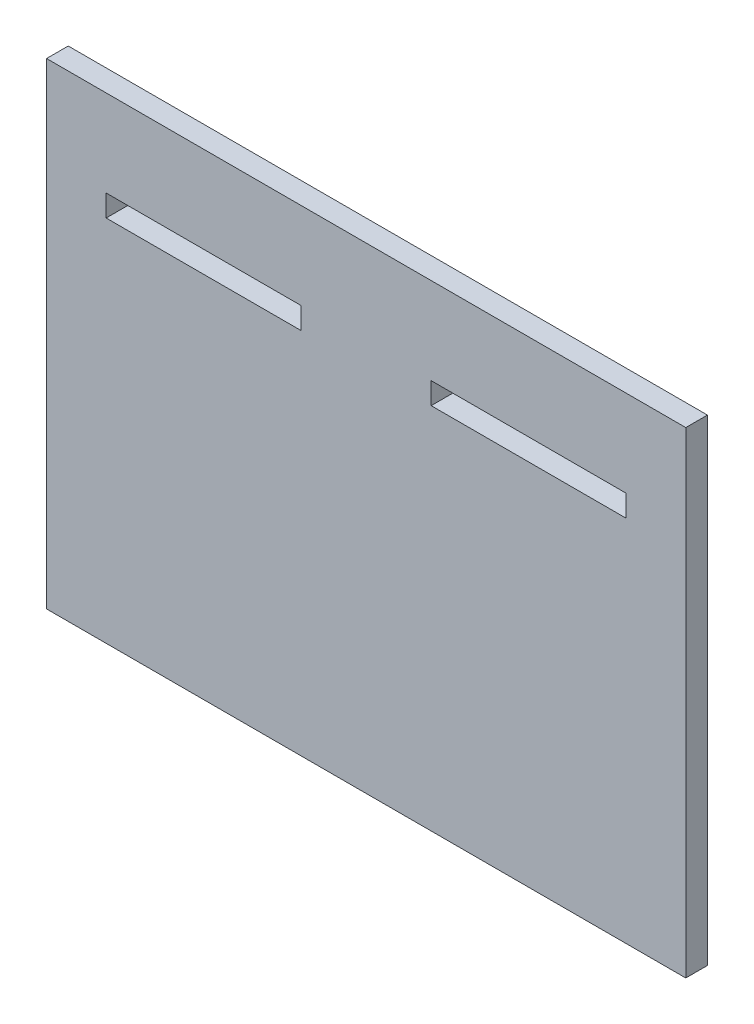
ISO-10303-21;
HEADER;
FILE_DESCRIPTION(('STEP AP214'),'2;1');
FILE_NAME('part.step','',(''),(''),'','','');
FILE_SCHEMA(('AUTOMOTIVE_DESIGN { 1 0 10303 214 1 1 1 1 }'));
ENDSEC;
DATA;
#1=APPLICATION_CONTEXT('core data for automotive mechanical design processes');
#2=APPLICATION_PROTOCOL_DEFINITION('international standard','automotive_design',2000,#1);
#3=PRODUCT_CONTEXT('',#1,'mechanical');
#4=PRODUCT('Part','Part','',(#3));
#5=PRODUCT_RELATED_PRODUCT_CATEGORY('part','',(#4));
#6=PRODUCT_DEFINITION_FORMATION('','',#4);
#7=PRODUCT_DEFINITION_CONTEXT('part definition',#1,'design');
#8=PRODUCT_DEFINITION('design','',#6,#7);
#9=PRODUCT_DEFINITION_SHAPE('','',#8);
#10=(LENGTH_UNIT() NAMED_UNIT(*) SI_UNIT(.MILLI.,.METRE.));
#11=(NAMED_UNIT(*) PLANE_ANGLE_UNIT() SI_UNIT($,.RADIAN.));
#12=(NAMED_UNIT(*) SI_UNIT($,.STERADIAN.) SOLID_ANGLE_UNIT());
#13=UNCERTAINTY_MEASURE_WITH_UNIT(LENGTH_MEASURE(1.E-05),#10,'distance_accuracy_value','');
#14=(GEOMETRIC_REPRESENTATION_CONTEXT(3) GLOBAL_UNCERTAINTY_ASSIGNED_CONTEXT((#13)) GLOBAL_UNIT_ASSIGNED_CONTEXT((#10,
#11,#12)) REPRESENTATION_CONTEXT('',''));
#15=CARTESIAN_POINT('',(0.,0.,0.));
#16=DIRECTION('',(0.,0.,1.));
#17=DIRECTION('',(1.,0.,0.));
#18=AXIS2_PLACEMENT_3D('',#15,#16,#17);
#19=CARTESIAN_POINT('',(0.,0.,10.));
#20=DIRECTION('',(0.,0.,-1.));
#21=DIRECTION('',(-1.,0.,0.));
#22=AXIS2_PLACEMENT_3D('',#19,#20,#21);
#23=PLANE('',#22);
#24=DIRECTION('',(0.,-1.,0.));
#25=VECTOR('',#24,1.);
#26=CARTESIAN_POINT('',(27.5,180.,10.));
#27=LINE('',#26,#25);
#28=CARTESIAN_POINT('',(27.5,180.,10.));
#29=VERTEX_POINT('',#28);
#30=CARTESIAN_POINT('',(27.5,170.,10.));
#31=VERTEX_POINT('',#30);
#32=EDGE_CURVE('E158',#29,#31,#27,.T.);
#33=ORIENTED_EDGE('',*,*,#32,.F.);
#34=DIRECTION('',(-1.,0.,0.));
#35=VECTOR('',#34,1.);
#36=CARTESIAN_POINT('',(27.5,180.,10.));
#37=LINE('',#36,#35);
#38=CARTESIAN_POINT('',(117.5,180.,10.));
#39=VERTEX_POINT('',#38);
#40=EDGE_CURVE('E166',#39,#29,#37,.T.);
#41=ORIENTED_EDGE('',*,*,#40,.F.);
#42=DIRECTION('',(0.,1.,0.));
#43=VECTOR('',#42,1.);
#44=CARTESIAN_POINT('',(117.5,180.,10.));
#45=LINE('',#44,#43);
#46=CARTESIAN_POINT('',(117.5,170.,10.));
#47=VERTEX_POINT('',#46);
#48=EDGE_CURVE('E163',#47,#39,#45,.T.);
#49=ORIENTED_EDGE('',*,*,#48,.F.);
#50=DIRECTION('',(1.,0.,0.));
#51=VECTOR('',#50,1.);
#52=CARTESIAN_POINT('',(27.5,170.,10.));
#53=LINE('',#52,#51);
#54=EDGE_CURVE('E160',#31,#47,#53,.T.);
#55=ORIENTED_EDGE('',*,*,#54,.F.);
#56=EDGE_LOOP('',(#33,#41,#49,#55));
#57=FACE_BOUND('',#56,.T.);
#58=DIRECTION('',(0.,-1.,0.));
#59=VECTOR('',#58,1.);
#60=CARTESIAN_POINT('',(0.,0.,10.));
#61=LINE('',#60,#59);
#62=CARTESIAN_POINT('',(0.,220.,10.));
#63=VERTEX_POINT('',#62);
#64=CARTESIAN_POINT('',(0.,0.,10.));
#65=VERTEX_POINT('',#64);
#66=EDGE_CURVE('E189',#63,#65,#61,.T.);
#67=ORIENTED_EDGE('',*,*,#66,.T.);
#68=DIRECTION('',(1.,0.,0.));
#69=VECTOR('',#68,1.);
#70=CARTESIAN_POINT('',(0.,0.,10.));
#71=LINE('',#70,#69);
#72=CARTESIAN_POINT('',(295.,0.,10.));
#73=VERTEX_POINT('',#72);
#74=EDGE_CURVE('E192',#65,#73,#71,.T.);
#75=ORIENTED_EDGE('',*,*,#74,.T.);
#76=DIRECTION('',(0.,1.,0.));
#77=VECTOR('',#76,1.);
#78=CARTESIAN_POINT('',(295.,0.,10.));
#79=LINE('',#78,#77);
#80=CARTESIAN_POINT('',(295.,220.,10.));
#81=VERTEX_POINT('',#80);
#82=EDGE_CURVE('E195',#73,#81,#79,.T.);
#83=ORIENTED_EDGE('',*,*,#82,.T.);
#84=DIRECTION('',(-1.,0.,0.));
#85=VECTOR('',#84,1.);
#86=CARTESIAN_POINT('',(0.,220.,10.));
#87=LINE('',#86,#85);
#88=EDGE_CURVE('E197',#81,#63,#87,.T.);
#89=ORIENTED_EDGE('',*,*,#88,.T.);
#90=EDGE_LOOP('',(#67,#75,#83,#89));
#91=FACE_BOUND('',#90,.T.);
#92=DIRECTION('',(0.,-1.,0.));
#93=VECTOR('',#92,1.);
#94=CARTESIAN_POINT('',(177.5,180.,10.));
#95=LINE('',#94,#93);
#96=CARTESIAN_POINT('',(177.5,180.,10.));
#97=VERTEX_POINT('',#96);
#98=CARTESIAN_POINT('',(177.5,170.,10.));
#99=VERTEX_POINT('',#98);
#100=EDGE_CURVE('E122',#97,#99,#95,.T.);
#101=ORIENTED_EDGE('',*,*,#100,.F.);
#102=DIRECTION('',(-1.,0.,0.));
#103=VECTOR('',#102,1.);
#104=CARTESIAN_POINT('',(177.5,180.,10.));
#105=LINE('',#104,#103);
#106=CARTESIAN_POINT('',(267.5,180.,10.));
#107=VERTEX_POINT('',#106);
#108=EDGE_CURVE('E144',#107,#97,#105,.T.);
#109=ORIENTED_EDGE('',*,*,#108,.F.);
#110=DIRECTION('',(0.,1.,0.));
#111=VECTOR('',#110,1.);
#112=CARTESIAN_POINT('',(267.5,180.,10.));
#113=LINE('',#112,#111);
#114=CARTESIAN_POINT('',(267.5,170.,10.));
#115=VERTEX_POINT('',#114);
#116=EDGE_CURVE('E142',#115,#107,#113,.T.);
#117=ORIENTED_EDGE('',*,*,#116,.F.);
#118=DIRECTION('',(1.,0.,0.));
#119=VECTOR('',#118,1.);
#120=CARTESIAN_POINT('',(177.5,170.,10.));
#121=LINE('',#120,#119);
#122=EDGE_CURVE('E130',#99,#115,#121,.T.);
#123=ORIENTED_EDGE('',*,*,#122,.F.);
#124=EDGE_LOOP('',(#101,#109,#117,#123));
#125=FACE_BOUND('',#124,.T.);
#126=ADVANCED_FACE('F33',(#57,#91,#125),#23,.F.);
#127=CARTESIAN_POINT('',(0.,0.,0.));
#128=DIRECTION('',(0.,0.,-1.));
#129=DIRECTION('',(-1.,0.,0.));
#130=AXIS2_PLACEMENT_3D('',#127,#128,#129);
#131=PLANE('',#130);
#132=DIRECTION('',(-1.,0.,0.));
#133=VECTOR('',#132,1.);
#134=CARTESIAN_POINT('',(27.5,180.,0.));
#135=LINE('',#134,#133);
#136=CARTESIAN_POINT('',(117.5,180.,0.));
#137=VERTEX_POINT('',#136);
#138=CARTESIAN_POINT('',(27.5,180.,0.));
#139=VERTEX_POINT('',#138);
#140=EDGE_CURVE('E161',#137,#139,#135,.T.);
#141=ORIENTED_EDGE('',*,*,#140,.T.);
#142=DIRECTION('',(0.,-1.,0.));
#143=VECTOR('',#142,1.);
#144=CARTESIAN_POINT('',(27.5,180.,0.));
#145=LINE('',#144,#143);
#146=CARTESIAN_POINT('',(27.5,170.,0.));
#147=VERTEX_POINT('',#146);
#148=EDGE_CURVE('E138',#139,#147,#145,.T.);
#149=ORIENTED_EDGE('',*,*,#148,.T.);
#150=DIRECTION('',(1.,0.,0.));
#151=VECTOR('',#150,1.);
#152=CARTESIAN_POINT('',(27.5,170.,0.));
#153=LINE('',#152,#151);
#154=CARTESIAN_POINT('',(117.5,170.,0.));
#155=VERTEX_POINT('',#154);
#156=EDGE_CURVE('E171',#147,#155,#153,.T.);
#157=ORIENTED_EDGE('',*,*,#156,.T.);
#158=DIRECTION('',(0.,1.,0.));
#159=VECTOR('',#158,1.);
#160=CARTESIAN_POINT('',(117.5,180.,0.));
#161=LINE('',#160,#159);
#162=EDGE_CURVE('E174',#155,#137,#161,.T.);
#163=ORIENTED_EDGE('',*,*,#162,.T.);
#164=EDGE_LOOP('',(#141,#149,#157,#163));
#165=FACE_BOUND('',#164,.T.);
#166=DIRECTION('',(0.,-1.,0.));
#167=VECTOR('',#166,1.);
#168=CARTESIAN_POINT('',(0.,0.,0.));
#169=LINE('',#168,#167);
#170=CARTESIAN_POINT('',(0.,220.,0.));
#171=VERTEX_POINT('',#170);
#172=CARTESIAN_POINT('',(0.,0.,0.));
#173=VERTEX_POINT('',#172);
#174=EDGE_CURVE('E188',#171,#173,#169,.T.);
#175=ORIENTED_EDGE('',*,*,#174,.F.);
#176=DIRECTION('',(-1.,0.,0.));
#177=VECTOR('',#176,1.);
#178=CARTESIAN_POINT('',(0.,220.,0.));
#179=LINE('',#178,#177);
#180=CARTESIAN_POINT('',(295.,220.,0.));
#181=VERTEX_POINT('',#180);
#182=EDGE_CURVE('E193',#181,#171,#179,.T.);
#183=ORIENTED_EDGE('',*,*,#182,.F.);
#184=DIRECTION('',(0.,1.,0.));
#185=VECTOR('',#184,1.);
#186=CARTESIAN_POINT('',(295.,0.,0.));
#187=LINE('',#186,#185);
#188=CARTESIAN_POINT('',(295.,0.,0.));
#189=VERTEX_POINT('',#188);
#190=EDGE_CURVE('E204',#189,#181,#187,.T.);
#191=ORIENTED_EDGE('',*,*,#190,.F.);
#192=DIRECTION('',(1.,0.,0.));
#193=VECTOR('',#192,1.);
#194=CARTESIAN_POINT('',(0.,0.,0.));
#195=LINE('',#194,#193);
#196=EDGE_CURVE('E202',#173,#189,#195,.T.);
#197=ORIENTED_EDGE('',*,*,#196,.F.);
#198=EDGE_LOOP('',(#175,#183,#191,#197));
#199=FACE_BOUND('',#198,.T.);
#200=DIRECTION('',(-1.,0.,0.));
#201=VECTOR('',#200,1.);
#202=CARTESIAN_POINT('',(177.5,180.,0.));
#203=LINE('',#202,#201);
#204=CARTESIAN_POINT('',(267.5,180.,0.));
#205=VERTEX_POINT('',#204);
#206=CARTESIAN_POINT('',(177.5,180.,0.));
#207=VERTEX_POINT('',#206);
#208=EDGE_CURVE('E131',#205,#207,#203,.T.);
#209=ORIENTED_EDGE('',*,*,#208,.T.);
#210=DIRECTION('',(0.,-1.,0.));
#211=VECTOR('',#210,1.);
#212=CARTESIAN_POINT('',(177.5,180.,0.));
#213=LINE('',#212,#211);
#214=CARTESIAN_POINT('',(177.5,170.,0.));
#215=VERTEX_POINT('',#214);
#216=EDGE_CURVE('E56',#207,#215,#213,.T.);
#217=ORIENTED_EDGE('',*,*,#216,.T.);
#218=DIRECTION('',(1.,0.,0.));
#219=VECTOR('',#218,1.);
#220=CARTESIAN_POINT('',(177.5,170.,0.));
#221=LINE('',#220,#219);
#222=CARTESIAN_POINT('',(267.5,170.,0.));
#223=VERTEX_POINT('',#222);
#224=EDGE_CURVE('E137',#215,#223,#221,.T.);
#225=ORIENTED_EDGE('',*,*,#224,.T.);
#226=DIRECTION('',(0.,1.,0.));
#227=VECTOR('',#226,1.);
#228=CARTESIAN_POINT('',(267.5,180.,0.));
#229=LINE('',#228,#227);
#230=EDGE_CURVE('E150',#223,#205,#229,.T.);
#231=ORIENTED_EDGE('',*,*,#230,.T.);
#232=EDGE_LOOP('',(#209,#217,#225,#231));
#233=FACE_BOUND('',#232,.T.);
#234=ADVANCED_FACE('F222',(#165,#199,#233),#131,.T.);
#235=CARTESIAN_POINT('',(0.,0.,10.));
#236=DIRECTION('',(1.,0.,0.));
#237=DIRECTION('',(0.,0.,-1.));
#238=AXIS2_PLACEMENT_3D('',#235,#236,#237);
#239=PLANE('',#238);
#240=ORIENTED_EDGE('',*,*,#174,.T.);
#241=DIRECTION('',(0.,0.,-1.));
#242=VECTOR('',#241,1.);
#243=CARTESIAN_POINT('',(0.,0.,10.));
#244=LINE('',#243,#242);
#245=EDGE_CURVE('E11',#65,#173,#244,.T.);
#246=ORIENTED_EDGE('',*,*,#245,.F.);
#247=ORIENTED_EDGE('',*,*,#66,.F.);
#248=DIRECTION('',(0.,0.,-1.));
#249=VECTOR('',#248,1.);
#250=CARTESIAN_POINT('',(0.,220.,10.));
#251=LINE('',#250,#249);
#252=EDGE_CURVE('E199',#63,#171,#251,.T.);
#253=ORIENTED_EDGE('',*,*,#252,.T.);
#254=EDGE_LOOP('',(#240,#246,#247,#253));
#255=FACE_BOUND('',#254,.T.);
#256=ADVANCED_FACE('F35',(#255),#239,.F.);
#257=CARTESIAN_POINT('',(0.,0.,10.));
#258=DIRECTION('',(0.,1.,0.));
#259=DIRECTION('',(0.,0.,1.));
#260=AXIS2_PLACEMENT_3D('',#257,#258,#259);
#261=PLANE('',#260);
#262=ORIENTED_EDGE('',*,*,#196,.T.);
#263=DIRECTION('',(0.,0.,-1.));
#264=VECTOR('',#263,1.);
#265=CARTESIAN_POINT('',(295.,0.,10.));
#266=LINE('',#265,#264);
#267=EDGE_CURVE('E41',#73,#189,#266,.T.);
#268=ORIENTED_EDGE('',*,*,#267,.F.);
#269=ORIENTED_EDGE('',*,*,#74,.F.);
#270=ORIENTED_EDGE('',*,*,#245,.T.);
#271=EDGE_LOOP('',(#262,#268,#269,#270));
#272=FACE_BOUND('',#271,.T.);
#273=ADVANCED_FACE('F232',(#272),#261,.F.);
#274=CARTESIAN_POINT('',(295.,0.,10.));
#275=DIRECTION('',(-1.,0.,0.));
#276=DIRECTION('',(0.,0.,1.));
#277=AXIS2_PLACEMENT_3D('',#274,#275,#276);
#278=PLANE('',#277);
#279=ORIENTED_EDGE('',*,*,#190,.T.);
#280=DIRECTION('',(0.,0.,-1.));
#281=VECTOR('',#280,1.);
#282=CARTESIAN_POINT('',(295.,220.,10.));
#283=LINE('',#282,#281);
#284=EDGE_CURVE('E209',#81,#181,#283,.T.);
#285=ORIENTED_EDGE('',*,*,#284,.F.);
#286=ORIENTED_EDGE('',*,*,#82,.F.);
#287=ORIENTED_EDGE('',*,*,#267,.T.);
#288=EDGE_LOOP('',(#279,#285,#286,#287));
#289=FACE_BOUND('',#288,.T.);
#290=ADVANCED_FACE('F216',(#289),#278,.F.);
#291=CARTESIAN_POINT('',(0.,220.,10.));
#292=DIRECTION('',(0.,-1.,0.));
#293=DIRECTION('',(0.,0.,-1.));
#294=AXIS2_PLACEMENT_3D('',#291,#292,#293);
#295=PLANE('',#294);
#296=ORIENTED_EDGE('',*,*,#182,.T.);
#297=ORIENTED_EDGE('',*,*,#252,.F.);
#298=ORIENTED_EDGE('',*,*,#88,.F.);
#299=ORIENTED_EDGE('',*,*,#284,.T.);
#300=EDGE_LOOP('',(#296,#297,#298,#299));
#301=FACE_BOUND('',#300,.T.);
#302=ADVANCED_FACE('F226',(#301),#295,.F.);
#303=CARTESIAN_POINT('',(27.5,180.,10.));
#304=DIRECTION('',(1.,0.,0.));
#305=DIRECTION('',(0.,0.,-1.));
#306=AXIS2_PLACEMENT_3D('',#303,#304,#305);
#307=PLANE('',#306);
#308=ORIENTED_EDGE('',*,*,#148,.F.);
#309=DIRECTION('',(0.,0.,-1.));
#310=VECTOR('',#309,1.);
#311=CARTESIAN_POINT('',(27.5,180.,10.));
#312=LINE('',#311,#310);
#313=EDGE_CURVE('E168',#29,#139,#312,.T.);
#314=ORIENTED_EDGE('',*,*,#313,.F.);
#315=ORIENTED_EDGE('',*,*,#32,.T.);
#316=DIRECTION('',(0.,0.,-1.));
#317=VECTOR('',#316,1.);
#318=CARTESIAN_POINT('',(27.5,170.,10.));
#319=LINE('',#318,#317);
#320=EDGE_CURVE('E185',#31,#147,#319,.T.);
#321=ORIENTED_EDGE('',*,*,#320,.T.);
#322=EDGE_LOOP('',(#308,#314,#315,#321));
#323=FACE_BOUND('',#322,.T.);
#324=ADVANCED_FACE('F249',(#323),#307,.T.);
#325=CARTESIAN_POINT('',(27.5,170.,10.));
#326=DIRECTION('',(0.,1.,0.));
#327=DIRECTION('',(0.,0.,1.));
#328=AXIS2_PLACEMENT_3D('',#325,#326,#327);
#329=PLANE('',#328);
#330=ORIENTED_EDGE('',*,*,#156,.F.);
#331=ORIENTED_EDGE('',*,*,#320,.F.);
#332=ORIENTED_EDGE('',*,*,#54,.T.);
#333=DIRECTION('',(0.,0.,-1.));
#334=VECTOR('',#333,1.);
#335=CARTESIAN_POINT('',(117.5,170.,10.));
#336=LINE('',#335,#334);
#337=EDGE_CURVE('E183',#47,#155,#336,.T.);
#338=ORIENTED_EDGE('',*,*,#337,.T.);
#339=EDGE_LOOP('',(#330,#331,#332,#338));
#340=FACE_BOUND('',#339,.T.);
#341=ADVANCED_FACE('F256',(#340),#329,.T.);
#342=CARTESIAN_POINT('',(117.5,180.,10.));
#343=DIRECTION('',(-1.,0.,0.));
#344=DIRECTION('',(0.,0.,1.));
#345=AXIS2_PLACEMENT_3D('',#342,#343,#344);
#346=PLANE('',#345);
#347=ORIENTED_EDGE('',*,*,#162,.F.);
#348=ORIENTED_EDGE('',*,*,#337,.F.);
#349=ORIENTED_EDGE('',*,*,#48,.T.);
#350=DIRECTION('',(0.,0.,-1.));
#351=VECTOR('',#350,1.);
#352=CARTESIAN_POINT('',(117.5,180.,10.));
#353=LINE('',#352,#351);
#354=EDGE_CURVE('E181',#39,#137,#353,.T.);
#355=ORIENTED_EDGE('',*,*,#354,.T.);
#356=EDGE_LOOP('',(#347,#348,#349,#355));
#357=FACE_BOUND('',#356,.T.);
#358=ADVANCED_FACE('F261',(#357),#346,.T.);
#359=CARTESIAN_POINT('',(27.5,180.,10.));
#360=DIRECTION('',(0.,-1.,0.));
#361=DIRECTION('',(0.,0.,-1.));
#362=AXIS2_PLACEMENT_3D('',#359,#360,#361);
#363=PLANE('',#362);
#364=ORIENTED_EDGE('',*,*,#140,.F.);
#365=ORIENTED_EDGE('',*,*,#354,.F.);
#366=ORIENTED_EDGE('',*,*,#40,.T.);
#367=ORIENTED_EDGE('',*,*,#313,.T.);
#368=EDGE_LOOP('',(#364,#365,#366,#367));
#369=FACE_BOUND('',#368,.T.);
#370=ADVANCED_FACE('F267',(#369),#363,.T.);
#371=CARTESIAN_POINT('',(177.5,180.,10.));
#372=DIRECTION('',(1.,0.,0.));
#373=DIRECTION('',(0.,0.,-1.));
#374=AXIS2_PLACEMENT_3D('',#371,#372,#373);
#375=PLANE('',#374);
#376=ORIENTED_EDGE('',*,*,#216,.F.);
#377=DIRECTION('',(0.,0.,-1.));
#378=VECTOR('',#377,1.);
#379=CARTESIAN_POINT('',(177.5,180.,10.));
#380=LINE('',#379,#378);
#381=EDGE_CURVE('E126',#97,#207,#380,.T.);
#382=ORIENTED_EDGE('',*,*,#381,.F.);
#383=ORIENTED_EDGE('',*,*,#100,.T.);
#384=DIRECTION('',(0.,0.,-1.));
#385=VECTOR('',#384,1.);
#386=CARTESIAN_POINT('',(177.5,170.,10.));
#387=LINE('',#386,#385);
#388=EDGE_CURVE('E125',#99,#215,#387,.T.);
#389=ORIENTED_EDGE('',*,*,#388,.T.);
#390=EDGE_LOOP('',(#376,#382,#383,#389));
#391=FACE_BOUND('',#390,.T.);
#392=ADVANCED_FACE('F124',(#391),#375,.T.);
#393=CARTESIAN_POINT('',(177.5,170.,10.));
#394=DIRECTION('',(0.,1.,0.));
#395=DIRECTION('',(0.,0.,1.));
#396=AXIS2_PLACEMENT_3D('',#393,#394,#395);
#397=PLANE('',#396);
#398=ORIENTED_EDGE('',*,*,#224,.F.);
#399=ORIENTED_EDGE('',*,*,#388,.F.);
#400=ORIENTED_EDGE('',*,*,#122,.T.);
#401=DIRECTION('',(0.,0.,-1.));
#402=VECTOR('',#401,1.);
#403=CARTESIAN_POINT('',(267.5,170.,10.));
#404=LINE('',#403,#402);
#405=EDGE_CURVE('E139',#115,#223,#404,.T.);
#406=ORIENTED_EDGE('',*,*,#405,.T.);
#407=EDGE_LOOP('',(#398,#399,#400,#406));
#408=FACE_BOUND('',#407,.T.);
#409=ADVANCED_FACE('F134',(#408),#397,.T.);
#410=CARTESIAN_POINT('',(267.5,180.,10.));
#411=DIRECTION('',(-1.,0.,0.));
#412=DIRECTION('',(0.,0.,1.));
#413=AXIS2_PLACEMENT_3D('',#410,#411,#412);
#414=PLANE('',#413);
#415=ORIENTED_EDGE('',*,*,#230,.F.);
#416=ORIENTED_EDGE('',*,*,#405,.F.);
#417=ORIENTED_EDGE('',*,*,#116,.T.);
#418=DIRECTION('',(0.,0.,-1.));
#419=VECTOR('',#418,1.);
#420=CARTESIAN_POINT('',(267.5,180.,10.));
#421=LINE('',#420,#419);
#422=EDGE_CURVE('E48',#107,#205,#421,.T.);
#423=ORIENTED_EDGE('',*,*,#422,.T.);
#424=EDGE_LOOP('',(#415,#416,#417,#423));
#425=FACE_BOUND('',#424,.T.);
#426=ADVANCED_FACE('F285',(#425),#414,.T.);
#427=CARTESIAN_POINT('',(177.5,180.,10.));
#428=DIRECTION('',(0.,-1.,0.));
#429=DIRECTION('',(0.,0.,-1.));
#430=AXIS2_PLACEMENT_3D('',#427,#428,#429);
#431=PLANE('',#430);
#432=ORIENTED_EDGE('',*,*,#208,.F.);
#433=ORIENTED_EDGE('',*,*,#422,.F.);
#434=ORIENTED_EDGE('',*,*,#108,.T.);
#435=ORIENTED_EDGE('',*,*,#381,.T.);
#436=EDGE_LOOP('',(#432,#433,#434,#435));
#437=FACE_BOUND('',#436,.T.);
#438=ADVANCED_FACE('F288',(#437),#431,.T.);
#439=CLOSED_SHELL('',(#126,#234,#256,#273,#290,#302,#324,#341,#358,#370,#392,#409,#426,#438));
#440=MANIFOLD_SOLID_BREP('B2',#439);
#441=ADVANCED_BREP_SHAPE_REPRESENTATION('',(#18,#440),#14);
#442=SHAPE_DEFINITION_REPRESENTATION(#9,#441);
ENDSEC;
END-ISO-10303-21;
